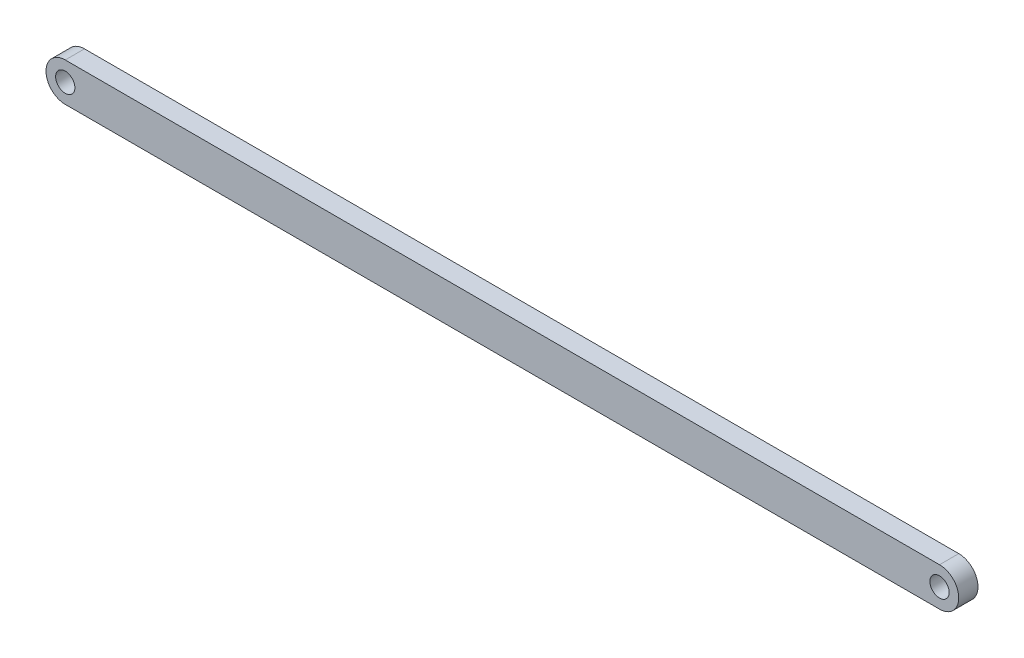
ISO-10303-21;
HEADER;
FILE_DESCRIPTION(('STEP AP214'),'2;1');
FILE_NAME('part.step','',(''),(''),'','','');
FILE_SCHEMA(('AUTOMOTIVE_DESIGN { 1 0 10303 214 1 1 1 1 }'));
ENDSEC;
DATA;
#1=APPLICATION_CONTEXT('core data for automotive mechanical design processes');
#2=APPLICATION_PROTOCOL_DEFINITION('international standard','automotive_design',2000,#1);
#3=PRODUCT_CONTEXT('',#1,'mechanical');
#4=PRODUCT('Part','Part','',(#3));
#5=PRODUCT_RELATED_PRODUCT_CATEGORY('part','',(#4));
#6=PRODUCT_DEFINITION_FORMATION('','',#4);
#7=PRODUCT_DEFINITION_CONTEXT('part definition',#1,'design');
#8=PRODUCT_DEFINITION('design','',#6,#7);
#9=PRODUCT_DEFINITION_SHAPE('','',#8);
#10=(LENGTH_UNIT() NAMED_UNIT(*) SI_UNIT(.MILLI.,.METRE.));
#11=(NAMED_UNIT(*) PLANE_ANGLE_UNIT() SI_UNIT($,.RADIAN.));
#12=(NAMED_UNIT(*) SI_UNIT($,.STERADIAN.) SOLID_ANGLE_UNIT());
#13=UNCERTAINTY_MEASURE_WITH_UNIT(LENGTH_MEASURE(1.E-05),#10,'distance_accuracy_value','');
#14=(GEOMETRIC_REPRESENTATION_CONTEXT(3) GLOBAL_UNCERTAINTY_ASSIGNED_CONTEXT((#13)) GLOBAL_UNIT_ASSIGNED_CONTEXT((#10,
#11,#12)) REPRESENTATION_CONTEXT('',''));
#15=CARTESIAN_POINT('',(0.,0.,0.));
#16=DIRECTION('',(0.,0.,1.));
#17=DIRECTION('',(1.,0.,0.));
#18=AXIS2_PLACEMENT_3D('',#15,#16,#17);
#19=CARTESIAN_POINT('',(113.59,0.,5.));
#20=DIRECTION('',(0.,0.,-1.));
#21=DIRECTION('',(-1.,0.,0.));
#22=AXIS2_PLACEMENT_3D('',#19,#20,#21);
#23=PLANE('',#22);
#24=CARTESIAN_POINT('',(113.59,0.,5.));
#25=DIRECTION('',(0.,0.,1.));
#26=DIRECTION('',(-1.,0.,0.));
#27=AXIS2_PLACEMENT_3D('',#24,#25,#26);
#28=CIRCLE('',#27,5.);
#29=CARTESIAN_POINT('',(113.59,-5.,5.));
#30=VERTEX_POINT('',#29);
#31=CARTESIAN_POINT('',(113.59,5.,5.));
#32=VERTEX_POINT('',#31);
#33=EDGE_CURVE('E96',#30,#32,#28,.T.);
#34=ORIENTED_EDGE('',*,*,#33,.T.);
#35=DIRECTION('',(-1.,0.,0.));
#36=VECTOR('',#35,1.);
#37=CARTESIAN_POINT('',(-113.59,5.,5.));
#38=LINE('',#37,#36);
#39=CARTESIAN_POINT('',(-113.59,5.,5.));
#40=VERTEX_POINT('',#39);
#41=EDGE_CURVE('E91',#32,#40,#38,.T.);
#42=ORIENTED_EDGE('',*,*,#41,.T.);
#43=CARTESIAN_POINT('',(-113.59,0.,5.));
#44=DIRECTION('',(0.,0.,1.));
#45=DIRECTION('',(1.,0.,0.));
#46=AXIS2_PLACEMENT_3D('',#43,#44,#45);
#47=CIRCLE('',#46,5.);
#48=CARTESIAN_POINT('',(-113.59,-5.,5.));
#49=VERTEX_POINT('',#48);
#50=EDGE_CURVE('E94',#40,#49,#47,.T.);
#51=ORIENTED_EDGE('',*,*,#50,.T.);
#52=DIRECTION('',(1.,0.,0.));
#53=VECTOR('',#52,1.);
#54=CARTESIAN_POINT('',(-113.59,-5.,5.));
#55=LINE('',#54,#53);
#56=EDGE_CURVE('E61',#49,#30,#55,.T.);
#57=ORIENTED_EDGE('',*,*,#56,.T.);
#58=EDGE_LOOP('',(#34,#42,#51,#57));
#59=FACE_BOUND('',#58,.T.);
#60=CARTESIAN_POINT('',(-113.59,0.,5.));
#61=DIRECTION('',(0.,0.,1.));
#62=DIRECTION('',(1.,0.,0.));
#63=AXIS2_PLACEMENT_3D('',#60,#61,#62);
#64=CIRCLE('',#63,2.5);
#65=CARTESIAN_POINT('',(-111.09,0.,5.));
#66=VERTEX_POINT('',#65);
#67=EDGE_CURVE('E116',#66,#66,#64,.T.);
#68=ORIENTED_EDGE('',*,*,#67,.F.);
#69=EDGE_LOOP('',(#68));
#70=FACE_BOUND('',#69,.T.);
#71=CARTESIAN_POINT('',(113.59,0.,5.));
#72=DIRECTION('',(0.,0.,1.));
#73=DIRECTION('',(1.,0.,0.));
#74=AXIS2_PLACEMENT_3D('',#71,#72,#73);
#75=CIRCLE('',#74,2.5);
#76=CARTESIAN_POINT('',(116.09,0.,5.));
#77=VERTEX_POINT('',#76);
#78=EDGE_CURVE('E138',#77,#77,#75,.T.);
#79=ORIENTED_EDGE('',*,*,#78,.F.);
#80=EDGE_LOOP('',(#79));
#81=FACE_BOUND('',#80,.T.);
#82=ADVANCED_FACE('F43',(#59,#70,#81),#23,.F.);
#83=CARTESIAN_POINT('',(113.59,0.,0.));
#84=DIRECTION('',(0.,0.,-1.));
#85=DIRECTION('',(-1.,0.,0.));
#86=AXIS2_PLACEMENT_3D('',#83,#84,#85);
#87=PLANE('',#86);
#88=CARTESIAN_POINT('',(-113.59,0.,0.));
#89=DIRECTION('',(0.,0.,1.));
#90=DIRECTION('',(1.,0.,0.));
#91=AXIS2_PLACEMENT_3D('',#88,#89,#90);
#92=CIRCLE('',#91,2.5);
#93=CARTESIAN_POINT('',(-111.09,0.,0.));
#94=VERTEX_POINT('',#93);
#95=EDGE_CURVE('E134',#94,#94,#92,.T.);
#96=ORIENTED_EDGE('',*,*,#95,.T.);
#97=EDGE_LOOP('',(#96));
#98=FACE_BOUND('',#97,.T.);
#99=CARTESIAN_POINT('',(113.59,0.,0.));
#100=DIRECTION('',(0.,0.,1.));
#101=DIRECTION('',(-1.,0.,0.));
#102=AXIS2_PLACEMENT_3D('',#99,#100,#101);
#103=CIRCLE('',#102,5.);
#104=CARTESIAN_POINT('',(113.59,-5.,0.));
#105=VERTEX_POINT('',#104);
#106=CARTESIAN_POINT('',(113.59,5.,0.));
#107=VERTEX_POINT('',#106);
#108=EDGE_CURVE('E112',#105,#107,#103,.T.);
#109=ORIENTED_EDGE('',*,*,#108,.F.);
#110=DIRECTION('',(1.,0.,0.));
#111=VECTOR('',#110,1.);
#112=CARTESIAN_POINT('',(-113.59,-5.,0.));
#113=LINE('',#112,#111);
#114=CARTESIAN_POINT('',(-113.59,-5.,0.));
#115=VERTEX_POINT('',#114);
#116=EDGE_CURVE('E84',#115,#105,#113,.T.);
#117=ORIENTED_EDGE('',*,*,#116,.F.);
#118=CARTESIAN_POINT('',(-113.59,0.,0.));
#119=DIRECTION('',(0.,0.,1.));
#120=DIRECTION('',(1.,0.,0.));
#121=AXIS2_PLACEMENT_3D('',#118,#119,#120);
#122=CIRCLE('',#121,5.);
#123=CARTESIAN_POINT('',(-113.59,5.,0.));
#124=VERTEX_POINT('',#123);
#125=EDGE_CURVE('E78',#124,#115,#122,.T.);
#126=ORIENTED_EDGE('',*,*,#125,.F.);
#127=DIRECTION('',(-1.,0.,0.));
#128=VECTOR('',#127,1.);
#129=CARTESIAN_POINT('',(-113.59,5.,0.));
#130=LINE('',#129,#128);
#131=EDGE_CURVE('E101',#107,#124,#130,.T.);
#132=ORIENTED_EDGE('',*,*,#131,.F.);
#133=EDGE_LOOP('',(#109,#117,#126,#132));
#134=FACE_BOUND('',#133,.T.);
#135=CARTESIAN_POINT('',(113.59,0.,0.));
#136=DIRECTION('',(0.,0.,1.));
#137=DIRECTION('',(1.,0.,0.));
#138=AXIS2_PLACEMENT_3D('',#135,#136,#137);
#139=CIRCLE('',#138,2.5);
#140=CARTESIAN_POINT('',(116.09,0.,0.));
#141=VERTEX_POINT('',#140);
#142=EDGE_CURVE('E142',#141,#141,#139,.T.);
#143=ORIENTED_EDGE('',*,*,#142,.T.);
#144=EDGE_LOOP('',(#143));
#145=FACE_BOUND('',#144,.T.);
#146=ADVANCED_FACE('F129',(#98,#134,#145),#87,.T.);
#147=CARTESIAN_POINT('',(113.59,0.,5.));
#148=DIRECTION('',(0.,0.,-1.));
#149=DIRECTION('',(-1.,0.,0.));
#150=AXIS2_PLACEMENT_3D('',#147,#148,#149);
#151=CYLINDRICAL_SURFACE('',#150,5.);
#152=ORIENTED_EDGE('',*,*,#108,.T.);
#153=DIRECTION('',(0.,0.,-1.));
#154=VECTOR('',#153,1.);
#155=CARTESIAN_POINT('',(113.59,5.,5.));
#156=LINE('',#155,#154);
#157=EDGE_CURVE('E11',#32,#107,#156,.T.);
#158=ORIENTED_EDGE('',*,*,#157,.F.);
#159=ORIENTED_EDGE('',*,*,#33,.F.);
#160=DIRECTION('',(0.,0.,-1.));
#161=VECTOR('',#160,1.);
#162=CARTESIAN_POINT('',(113.59,-5.,5.));
#163=LINE('',#162,#161);
#164=EDGE_CURVE('E108',#30,#105,#163,.T.);
#165=ORIENTED_EDGE('',*,*,#164,.T.);
#166=EDGE_LOOP('',(#152,#158,#159,#165));
#167=FACE_BOUND('',#166,.T.);
#168=ADVANCED_FACE('F45',(#167),#151,.T.);
#169=CARTESIAN_POINT('',(-113.59,5.,5.));
#170=DIRECTION('',(0.,-1.,0.));
#171=DIRECTION('',(0.,0.,-1.));
#172=AXIS2_PLACEMENT_3D('',#169,#170,#171);
#173=PLANE('',#172);
#174=ORIENTED_EDGE('',*,*,#131,.T.);
#175=DIRECTION('',(0.,0.,-1.));
#176=VECTOR('',#175,1.);
#177=CARTESIAN_POINT('',(-113.59,5.,5.));
#178=LINE('',#177,#176);
#179=EDGE_CURVE('E53',#40,#124,#178,.T.);
#180=ORIENTED_EDGE('',*,*,#179,.F.);
#181=ORIENTED_EDGE('',*,*,#41,.F.);
#182=ORIENTED_EDGE('',*,*,#157,.T.);
#183=EDGE_LOOP('',(#174,#180,#181,#182));
#184=FACE_BOUND('',#183,.T.);
#185=ADVANCED_FACE('F100',(#184),#173,.F.);
#186=CARTESIAN_POINT('',(-113.59,0.,5.));
#187=DIRECTION('',(0.,0.,-1.));
#188=DIRECTION('',(-1.,0.,0.));
#189=AXIS2_PLACEMENT_3D('',#186,#187,#188);
#190=CYLINDRICAL_SURFACE('',#189,5.);
#191=ORIENTED_EDGE('',*,*,#125,.T.);
#192=DIRECTION('',(0.,0.,-1.));
#193=VECTOR('',#192,1.);
#194=CARTESIAN_POINT('',(-113.59,-5.,5.));
#195=LINE('',#194,#193);
#196=EDGE_CURVE('E103',#49,#115,#195,.T.);
#197=ORIENTED_EDGE('',*,*,#196,.F.);
#198=ORIENTED_EDGE('',*,*,#50,.F.);
#199=ORIENTED_EDGE('',*,*,#179,.T.);
#200=EDGE_LOOP('',(#191,#197,#198,#199));
#201=FACE_BOUND('',#200,.T.);
#202=ADVANCED_FACE('F104',(#201),#190,.T.);
#203=CARTESIAN_POINT('',(-113.59,-5.,5.));
#204=DIRECTION('',(0.,1.,0.));
#205=DIRECTION('',(0.,0.,1.));
#206=AXIS2_PLACEMENT_3D('',#203,#204,#205);
#207=PLANE('',#206);
#208=ORIENTED_EDGE('',*,*,#116,.T.);
#209=ORIENTED_EDGE('',*,*,#164,.F.);
#210=ORIENTED_EDGE('',*,*,#56,.F.);
#211=ORIENTED_EDGE('',*,*,#196,.T.);
#212=EDGE_LOOP('',(#208,#209,#210,#211));
#213=FACE_BOUND('',#212,.T.);
#214=ADVANCED_FACE('F126',(#213),#207,.F.);
#215=CARTESIAN_POINT('',(-113.59,0.,5.));
#216=DIRECTION('',(0.,0.,-1.));
#217=DIRECTION('',(-1.,0.,0.));
#218=AXIS2_PLACEMENT_3D('',#215,#216,#217);
#219=CYLINDRICAL_SURFACE('',#218,2.5);
#220=ORIENTED_EDGE('',*,*,#67,.T.);
#221=EDGE_LOOP('',(#220));
#222=FACE_BOUND('',#221,.T.);
#223=ORIENTED_EDGE('',*,*,#95,.F.);
#224=EDGE_LOOP('',(#223));
#225=FACE_BOUND('',#224,.T.);
#226=ADVANCED_FACE('F161',(#222,#225),#219,.F.);
#227=CARTESIAN_POINT('',(113.59,0.,5.));
#228=DIRECTION('',(0.,0.,-1.));
#229=DIRECTION('',(-1.,0.,0.));
#230=AXIS2_PLACEMENT_3D('',#227,#228,#229);
#231=CYLINDRICAL_SURFACE('',#230,2.5);
#232=ORIENTED_EDGE('',*,*,#78,.T.);
#233=EDGE_LOOP('',(#232));
#234=FACE_BOUND('',#233,.T.);
#235=ORIENTED_EDGE('',*,*,#142,.F.);
#236=EDGE_LOOP('',(#235));
#237=FACE_BOUND('',#236,.T.);
#238=ADVANCED_FACE('F150',(#234,#237),#231,.F.);
#239=CLOSED_SHELL('',(#82,#146,#168,#185,#202,#214,#226,#238));
#240=MANIFOLD_SOLID_BREP('B2',#239);
#241=ADVANCED_BREP_SHAPE_REPRESENTATION('',(#18,#240),#14);
#242=SHAPE_DEFINITION_REPRESENTATION(#9,#241);
ENDSEC;
END-ISO-10303-21;
